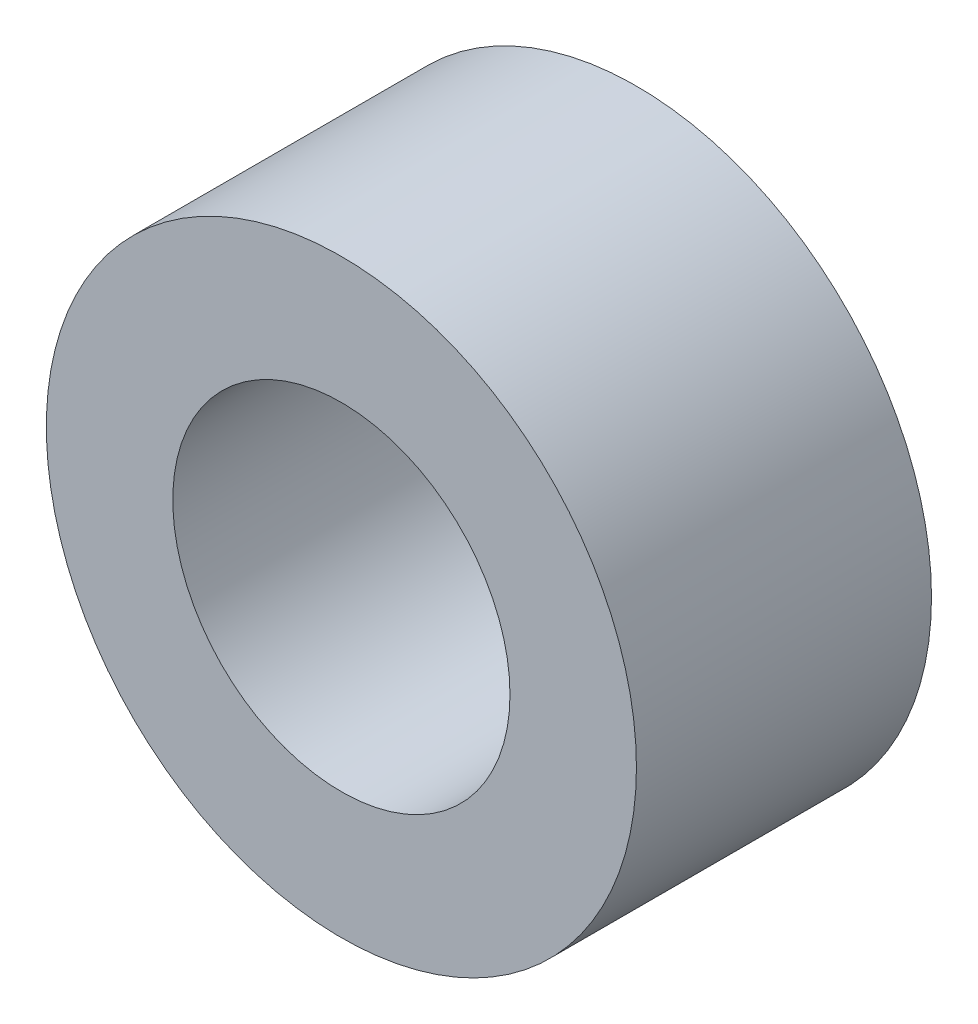
ISO-10303-21;
HEADER;
FILE_DESCRIPTION(('STEP AP214'),'2;1');
FILE_NAME('part.step','',(''),(''),'','','');
FILE_SCHEMA(('AUTOMOTIVE_DESIGN { 1 0 10303 214 1 1 1 1 }'));
ENDSEC;
DATA;
#1=APPLICATION_CONTEXT('core data for automotive mechanical design processes');
#2=APPLICATION_PROTOCOL_DEFINITION('international standard','automotive_design',2000,#1);
#3=PRODUCT_CONTEXT('',#1,'mechanical');
#4=PRODUCT('Part','Part','',(#3));
#5=PRODUCT_RELATED_PRODUCT_CATEGORY('part','',(#4));
#6=PRODUCT_DEFINITION_FORMATION('','',#4);
#7=PRODUCT_DEFINITION_CONTEXT('part definition',#1,'design');
#8=PRODUCT_DEFINITION('design','',#6,#7);
#9=PRODUCT_DEFINITION_SHAPE('','',#8);
#10=(LENGTH_UNIT() NAMED_UNIT(*) SI_UNIT(.MILLI.,.METRE.));
#11=(NAMED_UNIT(*) PLANE_ANGLE_UNIT() SI_UNIT($,.RADIAN.));
#12=(NAMED_UNIT(*) SI_UNIT($,.STERADIAN.) SOLID_ANGLE_UNIT());
#13=UNCERTAINTY_MEASURE_WITH_UNIT(LENGTH_MEASURE(1.E-05),#10,'distance_accuracy_value','');
#14=(GEOMETRIC_REPRESENTATION_CONTEXT(3) GLOBAL_UNCERTAINTY_ASSIGNED_CONTEXT((#13)) GLOBAL_UNIT_ASSIGNED_CONTEXT((#10,
#11,#12)) REPRESENTATION_CONTEXT('',''));
#15=CARTESIAN_POINT('',(0.,0.,0.));
#16=DIRECTION('',(0.,0.,1.));
#17=DIRECTION('',(1.,0.,0.));
#18=AXIS2_PLACEMENT_3D('',#15,#16,#17);
#19=CARTESIAN_POINT('',(0.,0.,35.));
#20=DIRECTION('',(0.,0.,1.));
#21=DIRECTION('',(1.,0.,0.));
#22=AXIS2_PLACEMENT_3D('',#19,#20,#21);
#23=PLANE('',#22);
#24=CARTESIAN_POINT('',(0.,0.,35.));
#25=DIRECTION('',(0.,0.,1.));
#26=DIRECTION('',(1.,0.,0.));
#27=AXIS2_PLACEMENT_3D('',#24,#25,#26);
#28=CIRCLE('',#27,35.);
#29=CARTESIAN_POINT('',(35.,0.,35.));
#30=VERTEX_POINT('',#29);
#31=EDGE_CURVE('E10',#30,#30,#28,.T.);
#32=ORIENTED_EDGE('',*,*,#31,.T.);
#33=EDGE_LOOP('',(#32));
#34=FACE_BOUND('',#33,.T.);
#35=CARTESIAN_POINT('',(0.,0.,35.));
#36=DIRECTION('',(0.,0.,1.));
#37=DIRECTION('',(1.,0.,0.));
#38=AXIS2_PLACEMENT_3D('',#35,#36,#37);
#39=CIRCLE('',#38,20.);
#40=CARTESIAN_POINT('',(20.,0.,35.));
#41=VERTEX_POINT('',#40);
#42=EDGE_CURVE('E45',#41,#41,#39,.T.);
#43=ORIENTED_EDGE('',*,*,#42,.F.);
#44=EDGE_LOOP('',(#43));
#45=FACE_BOUND('',#44,.T.);
#46=ADVANCED_FACE('F34',(#34,#45),#23,.T.);
#47=CARTESIAN_POINT('',(0.,0.,0.));
#48=DIRECTION('',(0.,0.,1.));
#49=DIRECTION('',(1.,0.,0.));
#50=AXIS2_PLACEMENT_3D('',#47,#48,#49);
#51=PLANE('',#50);
#52=CARTESIAN_POINT('',(0.,0.,0.));
#53=DIRECTION('',(0.,0.,1.));
#54=DIRECTION('',(1.,0.,0.));
#55=AXIS2_PLACEMENT_3D('',#52,#53,#54);
#56=CIRCLE('',#55,35.);
#57=CARTESIAN_POINT('',(35.,0.,0.));
#58=VERTEX_POINT('',#57);
#59=EDGE_CURVE('E38',#58,#58,#56,.T.);
#60=ORIENTED_EDGE('',*,*,#59,.F.);
#61=EDGE_LOOP('',(#60));
#62=FACE_BOUND('',#61,.T.);
#63=CARTESIAN_POINT('',(0.,0.,0.));
#64=DIRECTION('',(0.,0.,1.));
#65=DIRECTION('',(1.,0.,0.));
#66=AXIS2_PLACEMENT_3D('',#63,#64,#65);
#67=CIRCLE('',#66,20.);
#68=CARTESIAN_POINT('',(20.,0.,0.));
#69=VERTEX_POINT('',#68);
#70=EDGE_CURVE('E47',#69,#69,#67,.T.);
#71=ORIENTED_EDGE('',*,*,#70,.T.);
#72=EDGE_LOOP('',(#71));
#73=FACE_BOUND('',#72,.T.);
#74=ADVANCED_FACE('F57',(#62,#73),#51,.F.);
#75=CARTESIAN_POINT('',(0.,0.,35.));
#76=DIRECTION('',(0.,0.,-1.));
#77=DIRECTION('',(-1.,0.,0.));
#78=AXIS2_PLACEMENT_3D('',#75,#76,#77);
#79=CYLINDRICAL_SURFACE('',#78,35.);
#80=ORIENTED_EDGE('',*,*,#31,.F.);
#81=EDGE_LOOP('',(#80));
#82=FACE_BOUND('',#81,.T.);
#83=ORIENTED_EDGE('',*,*,#59,.T.);
#84=EDGE_LOOP('',(#83));
#85=FACE_BOUND('',#84,.T.);
#86=ADVANCED_FACE('F36',(#82,#85),#79,.T.);
#87=CARTESIAN_POINT('',(0.,0.,35.));
#88=DIRECTION('',(0.,0.,-1.));
#89=DIRECTION('',(-1.,0.,0.));
#90=AXIS2_PLACEMENT_3D('',#87,#88,#89);
#91=CYLINDRICAL_SURFACE('',#90,20.);
#92=ORIENTED_EDGE('',*,*,#42,.T.);
#93=EDGE_LOOP('',(#92));
#94=FACE_BOUND('',#93,.T.);
#95=ORIENTED_EDGE('',*,*,#70,.F.);
#96=EDGE_LOOP('',(#95));
#97=FACE_BOUND('',#96,.T.);
#98=ADVANCED_FACE('F53',(#94,#97),#91,.F.);
#99=CLOSED_SHELL('',(#46,#74,#86,#98));
#100=MANIFOLD_SOLID_BREP('B2',#99);
#101=ADVANCED_BREP_SHAPE_REPRESENTATION('',(#18,#100),#14);
#102=SHAPE_DEFINITION_REPRESENTATION(#9,#101);
ENDSEC;
END-ISO-10303-21;
